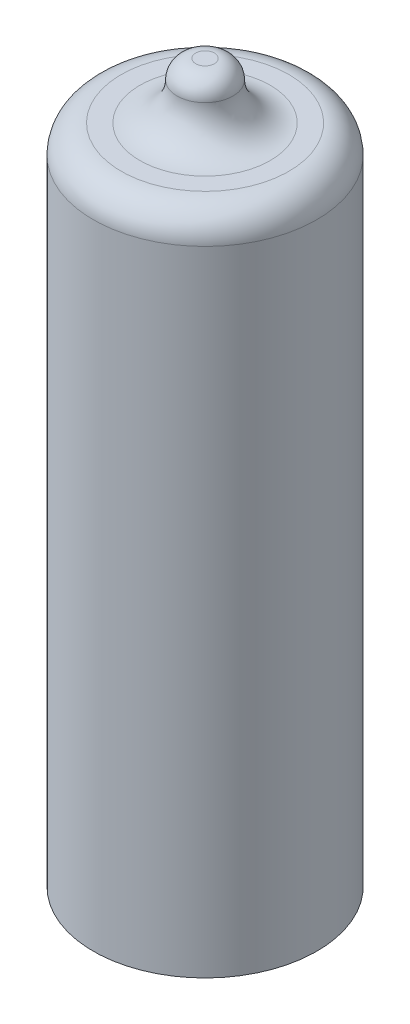
ISO-10303-21;
HEADER;
FILE_DESCRIPTION(('STEP AP214'),'2;1');
FILE_NAME('part.step','',(''),(''),'','','');
FILE_SCHEMA(('AUTOMOTIVE_DESIGN { 1 0 10303 214 1 1 1 1 }'));
ENDSEC;
DATA;
#1=APPLICATION_CONTEXT('core data for automotive mechanical design processes');
#2=APPLICATION_PROTOCOL_DEFINITION('international standard','automotive_design',2000,#1);
#3=PRODUCT_CONTEXT('',#1,'mechanical');
#4=PRODUCT('Part','Part','',(#3));
#5=PRODUCT_RELATED_PRODUCT_CATEGORY('part','',(#4));
#6=PRODUCT_DEFINITION_FORMATION('','',#4);
#7=PRODUCT_DEFINITION_CONTEXT('part definition',#1,'design');
#8=PRODUCT_DEFINITION('design','',#6,#7);
#9=PRODUCT_DEFINITION_SHAPE('','',#8);
#10=(LENGTH_UNIT() NAMED_UNIT(*) SI_UNIT(.MILLI.,.METRE.));
#11=(NAMED_UNIT(*) PLANE_ANGLE_UNIT() SI_UNIT($,.RADIAN.));
#12=(NAMED_UNIT(*) SI_UNIT($,.STERADIAN.) SOLID_ANGLE_UNIT());
#13=UNCERTAINTY_MEASURE_WITH_UNIT(LENGTH_MEASURE(1.E-05),#10,'distance_accuracy_value','');
#14=(GEOMETRIC_REPRESENTATION_CONTEXT(3) GLOBAL_UNCERTAINTY_ASSIGNED_CONTEXT((#13)) GLOBAL_UNIT_ASSIGNED_CONTEXT((#10,
#11,#12)) REPRESENTATION_CONTEXT('',''));
#15=CARTESIAN_POINT('',(0.,0.,0.));
#16=DIRECTION('',(0.,0.,1.));
#17=DIRECTION('',(1.,0.,0.));
#18=AXIS2_PLACEMENT_3D('',#15,#16,#17);
#19=CARTESIAN_POINT('',(0.,4.5,0.));
#20=DIRECTION('',(0.,1.,0.));
#21=DIRECTION('',(0.,0.,1.));
#22=AXIS2_PLACEMENT_3D('',#19,#20,#21);
#23=PLANE('',#22);
#24=CARTESIAN_POINT('',(0.,4.5,0.));
#25=DIRECTION('',(0.,-1.,0.));
#26=DIRECTION('',(0.,0.,-1.));
#27=AXIS2_PLACEMENT_3D('',#24,#25,#26);
#28=CIRCLE('',#27,6.);
#29=CARTESIAN_POINT('',(0.,4.5,-6.));
#30=VERTEX_POINT('',#29);
#31=EDGE_CURVE('E63',#30,#30,#28,.T.);
#32=ORIENTED_EDGE('',*,*,#31,.T.);
#33=EDGE_LOOP('',(#32));
#34=FACE_BOUND('',#33,.T.);
#35=ADVANCED_FACE('F33',(#34),#23,.F.);
#36=CARTESIAN_POINT('',(0.,0.,0.));
#37=DIRECTION('',(0.,-1.,0.));
#38=DIRECTION('',(0.,0.,-1.));
#39=AXIS2_PLACEMENT_3D('',#36,#37,#38);
#40=CYLINDRICAL_SURFACE('',#39,6.);
#41=CARTESIAN_POINT('',(0.,38.5,0.));
#42=DIRECTION('',(0.,-1.,0.));
#43=DIRECTION('',(0.,0.,-1.));
#44=AXIS2_PLACEMENT_3D('',#41,#42,#43);
#45=CIRCLE('',#44,6.);
#46=CARTESIAN_POINT('',(0.,38.5,-6.));
#47=VERTEX_POINT('',#46);
#48=EDGE_CURVE('E60',#47,#47,#45,.T.);
#49=ORIENTED_EDGE('',*,*,#48,.T.);
#50=EDGE_LOOP('',(#49));
#51=FACE_BOUND('',#50,.T.);
#52=ORIENTED_EDGE('',*,*,#31,.F.);
#53=EDGE_LOOP('',(#52));
#54=FACE_BOUND('',#53,.T.);
#55=ADVANCED_FACE('F100',(#51,#54),#40,.T.);
#56=CARTESIAN_POINT('',(-6.,40.,0.));
#57=DIRECTION('',(0.,-1.,0.));
#58=DIRECTION('',(0.,0.,-1.));
#59=AXIS2_PLACEMENT_3D('',#56,#57,#58);
#60=PLANE('',#59);
#61=CARTESIAN_POINT('',(0.,40.,0.));
#62=DIRECTION('',(0.,-1.,0.));
#63=DIRECTION('',(0.,0.,-1.));
#64=AXIS2_PLACEMENT_3D('',#61,#62,#63);
#65=CIRCLE('',#64,3.5);
#66=CARTESIAN_POINT('',(0.,40.,-3.5));
#67=VERTEX_POINT('',#66);
#68=EDGE_CURVE('E45',#67,#67,#65,.T.);
#69=ORIENTED_EDGE('',*,*,#68,.T.);
#70=EDGE_LOOP('',(#69));
#71=FACE_BOUND('',#70,.T.);
#72=CARTESIAN_POINT('',(0.,40.,0.));
#73=DIRECTION('',(0.,-1.,0.));
#74=DIRECTION('',(0.,0.,-1.));
#75=AXIS2_PLACEMENT_3D('',#72,#73,#74);
#76=CIRCLE('',#75,4.5);
#77=CARTESIAN_POINT('',(0.,40.,-4.5));
#78=VERTEX_POINT('',#77);
#79=EDGE_CURVE('E57',#78,#78,#76,.F.);
#80=ORIENTED_EDGE('',*,*,#79,.T.);
#81=EDGE_LOOP('',(#80));
#82=FACE_BOUND('',#81,.T.);
#83=ADVANCED_FACE('F97',(#71,#82),#60,.F.);
#84=CARTESIAN_POINT('',(-1.5,43.,0.));
#85=DIRECTION('',(0.,-1.,0.));
#86=DIRECTION('',(0.,0.,-1.));
#87=AXIS2_PLACEMENT_3D('',#84,#85,#86);
#88=PLANE('',#87);
#89=CARTESIAN_POINT('',(0.,43.,0.));
#90=DIRECTION('',(0.,-1.,0.));
#91=DIRECTION('',(0.,0.,-1.));
#92=AXIS2_PLACEMENT_3D('',#89,#90,#91);
#93=CIRCLE('',#92,0.5);
#94=CARTESIAN_POINT('',(0.,43.,-0.5));
#95=VERTEX_POINT('',#94);
#96=EDGE_CURVE('E10',#95,#95,#93,.F.);
#97=ORIENTED_EDGE('',*,*,#96,.T.);
#98=EDGE_LOOP('',(#97));
#99=FACE_BOUND('',#98,.T.);
#100=ADVANCED_FACE('F93',(#99),#88,.F.);
#101=CARTESIAN_POINT('',(0.,38.5,0.));
#102=DIRECTION('',(0.,-1.,0.));
#103=DIRECTION('',(0.,0.,-1.));
#104=AXIS2_PLACEMENT_3D('',#101,#102,#103);
#105=TOROIDAL_SURFACE('',#104,4.5,1.5);
#106=ORIENTED_EDGE('',*,*,#79,.F.);
#107=EDGE_LOOP('',(#106));
#108=FACE_BOUND('',#107,.T.);
#109=ORIENTED_EDGE('',*,*,#48,.F.);
#110=EDGE_LOOP('',(#109));
#111=FACE_BOUND('',#110,.T.);
#112=ADVANCED_FACE('F96',(#108,#111),#105,.T.);
#113=CARTESIAN_POINT('',(0.,42.,0.));
#114=DIRECTION('',(0.,-1.,0.));
#115=DIRECTION('',(0.,0.,-1.));
#116=AXIS2_PLACEMENT_3D('',#113,#114,#115);
#117=TOROIDAL_SURFACE('',#116,3.5,2.);
#118=CARTESIAN_POINT('',(0.,42.,0.));
#119=DIRECTION('',(0.,-1.,0.));
#120=DIRECTION('',(0.,0.,-1.));
#121=AXIS2_PLACEMENT_3D('',#118,#119,#120);
#122=CIRCLE('',#121,1.5);
#123=CARTESIAN_POINT('',(0.,42.,-1.5));
#124=VERTEX_POINT('',#123);
#125=EDGE_CURVE('E41',#124,#124,#122,.F.);
#126=ORIENTED_EDGE('',*,*,#125,.F.);
#127=EDGE_LOOP('',(#126));
#128=FACE_BOUND('',#127,.T.);
#129=ORIENTED_EDGE('',*,*,#68,.F.);
#130=EDGE_LOOP('',(#129));
#131=FACE_BOUND('',#130,.T.);
#132=ADVANCED_FACE('F109',(#128,#131),#117,.F.);
#133=CARTESIAN_POINT('',(0.,42.,0.));
#134=DIRECTION('',(0.,-1.,0.));
#135=DIRECTION('',(0.,0.,-1.));
#136=AXIS2_PLACEMENT_3D('',#133,#134,#135);
#137=DEGENERATE_TOROIDAL_SURFACE('',#136,0.5,1.,.T.);
#138=ORIENTED_EDGE('',*,*,#96,.F.);
#139=EDGE_LOOP('',(#138));
#140=FACE_BOUND('',#139,.T.);
#141=ORIENTED_EDGE('',*,*,#125,.T.);
#142=EDGE_LOOP('',(#141));
#143=FACE_BOUND('',#142,.T.);
#144=ADVANCED_FACE('F35',(#140,#143),#137,.T.);
#145=CLOSED_SHELL('',(#35,#55,#83,#100,#112,#132,#144));
#146=CARTESIAN_POINT('',(0.,39.8,0.));
#147=DIRECTION('',(0.,1.,0.));
#148=DIRECTION('',(0.,0.,1.));
#149=AXIS2_PLACEMENT_3D('',#146,#147,#148);
#150=PLANE('',#149);
#151=CARTESIAN_POINT('',(0.,39.8,0.));
#152=DIRECTION('',(0.,1.,0.));
#153=DIRECTION('',(0.,0.,1.));
#154=AXIS2_PLACEMENT_3D('',#151,#152,#153);
#155=CIRCLE('',#154,4.3);
#156=CARTESIAN_POINT('',(0.,39.8,4.3));
#157=VERTEX_POINT('',#156);
#158=EDGE_CURVE('E54',#157,#157,#155,.F.);
#159=ORIENTED_EDGE('',*,*,#158,.T.);
#160=EDGE_LOOP('',(#159));
#161=FACE_BOUND('',#160,.T.);
#162=ADVANCED_FACE('F83',(#161),#150,.F.);
#163=CARTESIAN_POINT('',(0.,0.,0.));
#164=DIRECTION('',(0.,-1.,0.));
#165=DIRECTION('',(0.,0.,-1.));
#166=AXIS2_PLACEMENT_3D('',#163,#164,#165);
#167=CYLINDRICAL_SURFACE('',#166,5.8);
#168=CARTESIAN_POINT('',(0.,38.3,0.));
#169=DIRECTION('',(0.,1.,0.));
#170=DIRECTION('',(0.,0.,1.));
#171=AXIS2_PLACEMENT_3D('',#168,#169,#170);
#172=CIRCLE('',#171,5.8);
#173=CARTESIAN_POINT('',(0.,38.3,5.8));
#174=VERTEX_POINT('',#173);
#175=EDGE_CURVE('E49',#174,#174,#172,.T.);
#176=ORIENTED_EDGE('',*,*,#175,.T.);
#177=EDGE_LOOP('',(#176));
#178=FACE_BOUND('',#177,.T.);
#179=CARTESIAN_POINT('',(0.,5.,0.));
#180=DIRECTION('',(0.,-1.,0.));
#181=DIRECTION('',(0.,0.,-1.));
#182=AXIS2_PLACEMENT_3D('',#179,#180,#181);
#183=CIRCLE('',#182,5.8);
#184=CARTESIAN_POINT('',(0.,5.,-5.8));
#185=VERTEX_POINT('',#184);
#186=EDGE_CURVE('E66',#185,#185,#183,.T.);
#187=ORIENTED_EDGE('',*,*,#186,.T.);
#188=EDGE_LOOP('',(#187));
#189=FACE_BOUND('',#188,.T.);
#190=ADVANCED_FACE('F70',(#178,#189),#167,.F.);
#191=CARTESIAN_POINT('',(-5.8,5.,0.));
#192=DIRECTION('',(0.,-1.,0.));
#193=DIRECTION('',(0.,0.,-1.));
#194=AXIS2_PLACEMENT_3D('',#191,#192,#193);
#195=PLANE('',#194);
#196=ORIENTED_EDGE('',*,*,#186,.F.);
#197=EDGE_LOOP('',(#196));
#198=FACE_BOUND('',#197,.T.);
#199=ADVANCED_FACE('F72',(#198),#195,.F.);
#200=CARTESIAN_POINT('',(0.,38.3,0.));
#201=DIRECTION('',(0.,1.,0.));
#202=DIRECTION('',(0.,0.,1.));
#203=AXIS2_PLACEMENT_3D('',#200,#201,#202);
#204=TOROIDAL_SURFACE('',#203,4.3,1.5);
#205=ORIENTED_EDGE('',*,*,#175,.F.);
#206=EDGE_LOOP('',(#205));
#207=FACE_BOUND('',#206,.T.);
#208=ORIENTED_EDGE('',*,*,#158,.F.);
#209=EDGE_LOOP('',(#208));
#210=FACE_BOUND('',#209,.T.);
#211=ADVANCED_FACE('F74',(#207,#210),#204,.F.);
#212=CLOSED_SHELL('',(#162,#190,#199,#211));
#213=ORIENTED_CLOSED_SHELL('',*,#212,.T.);
#214=BREP_WITH_VOIDS('B2',#145,(#213));
#215=ADVANCED_BREP_SHAPE_REPRESENTATION('',(#18,#214),#14);
#216=SHAPE_DEFINITION_REPRESENTATION(#9,#215);
ENDSEC;
END-ISO-10303-21;
